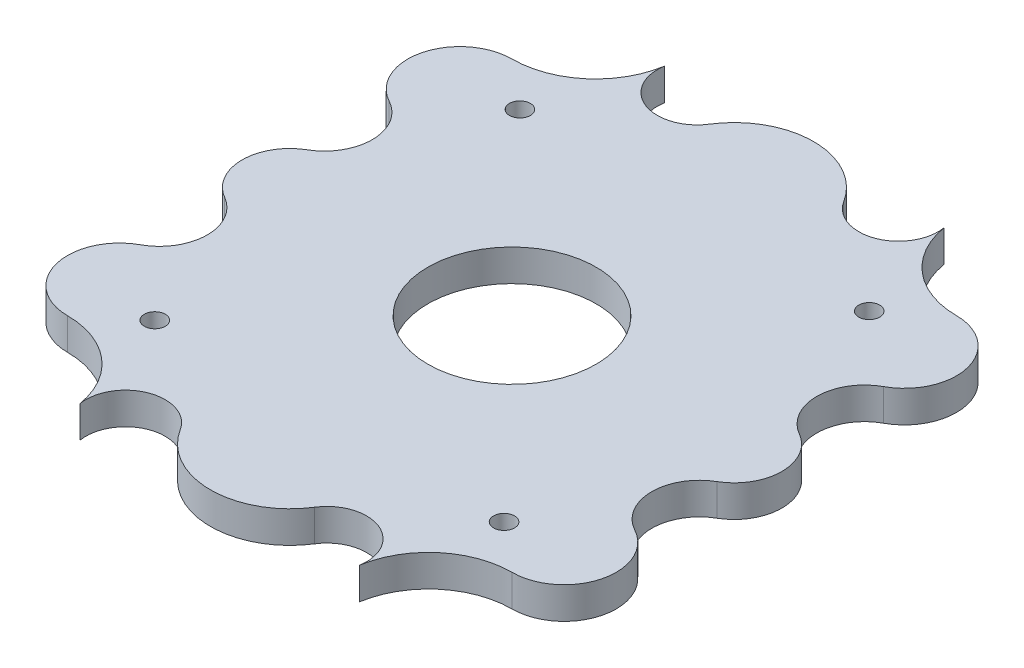
ISO-10303-21;
HEADER;
FILE_DESCRIPTION(('STEP AP214'),'2;1');
FILE_NAME('part.step','',(''),(''),'','','');
FILE_SCHEMA(('AUTOMOTIVE_DESIGN { 1 0 10303 214 1 1 1 1 }'));
ENDSEC;
DATA;
#1=APPLICATION_CONTEXT('core data for automotive mechanical design processes');
#2=APPLICATION_PROTOCOL_DEFINITION('international standard','automotive_design',2000,#1);
#3=PRODUCT_CONTEXT('',#1,'mechanical');
#4=PRODUCT('Part','Part','',(#3));
#5=PRODUCT_RELATED_PRODUCT_CATEGORY('part','',(#4));
#6=PRODUCT_DEFINITION_FORMATION('','',#4);
#7=PRODUCT_DEFINITION_CONTEXT('part definition',#1,'design');
#8=PRODUCT_DEFINITION('design','',#6,#7);
#9=PRODUCT_DEFINITION_SHAPE('','',#8);
#10=(LENGTH_UNIT() NAMED_UNIT(*) SI_UNIT(.MILLI.,.METRE.));
#11=(NAMED_UNIT(*) PLANE_ANGLE_UNIT() SI_UNIT($,.RADIAN.));
#12=(NAMED_UNIT(*) SI_UNIT($,.STERADIAN.) SOLID_ANGLE_UNIT());
#13=UNCERTAINTY_MEASURE_WITH_UNIT(LENGTH_MEASURE(1.E-05),#10,'distance_accuracy_value','');
#14=(GEOMETRIC_REPRESENTATION_CONTEXT(3) GLOBAL_UNCERTAINTY_ASSIGNED_CONTEXT((#13)) GLOBAL_UNIT_ASSIGNED_CONTEXT((#10,
#11,#12)) REPRESENTATION_CONTEXT('',''));
#15=CARTESIAN_POINT('',(0.,0.,0.));
#16=DIRECTION('',(0.,0.,1.));
#17=DIRECTION('',(1.,0.,0.));
#18=AXIS2_PLACEMENT_3D('',#15,#16,#17);
#19=CARTESIAN_POINT('',(70.,0.,-96.2922747821949));
#20=DIRECTION('',(0.,1.,0.));
#21=DIRECTION('',(0.,0.,1.));
#22=AXIS2_PLACEMENT_3D('',#19,#20,#21);
#23=PLANE('',#22);
#24=CARTESIAN_POINT('',(-55.,0.,57.5));
#25=DIRECTION('',(0.,-1.,0.));
#26=DIRECTION('',(0.,0.,-1.));
#27=AXIS2_PLACEMENT_3D('',#24,#25,#26);
#28=CIRCLE('',#27,5.49999999999999);
#29=CARTESIAN_POINT('',(-55.,0.,52.));
#30=VERTEX_POINT('',#29);
#31=EDGE_CURVE('E657',#30,#30,#28,.T.);
#32=ORIENTED_EDGE('',*,*,#31,.F.);
#33=EDGE_LOOP('',(#32));
#34=FACE_BOUND('',#33,.T.);
#35=CARTESIAN_POINT('',(55.,0.,57.5));
#36=DIRECTION('',(0.,-1.,0.));
#37=DIRECTION('',(0.,0.,-1.));
#38=AXIS2_PLACEMENT_3D('',#35,#36,#37);
#39=CIRCLE('',#38,5.49999999999999);
#40=CARTESIAN_POINT('',(55.,0.,52.));
#41=VERTEX_POINT('',#40);
#42=EDGE_CURVE('E667',#41,#41,#39,.T.);
#43=ORIENTED_EDGE('',*,*,#42,.F.);
#44=EDGE_LOOP('',(#43));
#45=FACE_BOUND('',#44,.T.);
#46=CARTESIAN_POINT('',(55.,0.,-57.5));
#47=DIRECTION('',(0.,-1.,0.));
#48=DIRECTION('',(0.,0.,-1.));
#49=AXIS2_PLACEMENT_3D('',#46,#47,#48);
#50=CIRCLE('',#49,5.49999999999999);
#51=CARTESIAN_POINT('',(55.,0.,-63.));
#52=VERTEX_POINT('',#51);
#53=EDGE_CURVE('E679',#52,#52,#50,.T.);
#54=ORIENTED_EDGE('',*,*,#53,.F.);
#55=EDGE_LOOP('',(#54));
#56=FACE_BOUND('',#55,.T.);
#57=CARTESIAN_POINT('',(0.,0.,0.));
#58=DIRECTION('',(0.,1.,0.));
#59=DIRECTION('',(0.,0.,1.));
#60=AXIS2_PLACEMENT_3D('',#57,#58,#59);
#61=CIRCLE('',#60,26.5);
#62=CARTESIAN_POINT('',(0.,0.,26.5));
#63=VERTEX_POINT('',#62);
#64=EDGE_CURVE('E275',#63,#63,#61,.T.);
#65=ORIENTED_EDGE('',*,*,#64,.T.);
#66=EDGE_LOOP('',(#65));
#67=FACE_BOUND('',#66,.T.);
#68=CARTESIAN_POINT('',(70.,0.,-96.2922747821949));
#69=DIRECTION('',(0.,-1.,0.));
#70=DIRECTION('',(0.,0.,1.));
#71=AXIS2_PLACEMENT_3D('',#68,#69,#70);
#72=CIRCLE('',#71,26.2922747821949);
#73=CARTESIAN_POINT('',(70.,0.,-70.));
#74=VERTEX_POINT('',#73);
#75=CARTESIAN_POINT('',(44.0559087554756,0.,-92.0275540740791));
#76=VERTEX_POINT('',#75);
#77=EDGE_CURVE('E176',#74,#76,#72,.T.);
#78=ORIENTED_EDGE('',*,*,#77,.F.);
#79=CARTESIAN_POINT('',(70.,0.,-53.5842229288624));
#80=DIRECTION('',(0.,1.,0.));
#81=DIRECTION('',(0.,0.,1.));
#82=AXIS2_PLACEMENT_3D('',#79,#80,#81);
#83=CIRCLE('',#82,16.4157770711376);
#84=CARTESIAN_POINT('',(77.8379934868232,0.,-39.1605065232405));
#85=VERTEX_POINT('',#84);
#86=EDGE_CURVE('E327',#85,#74,#83,.T.);
#87=ORIENTED_EDGE('',*,*,#86,.F.);
#88=CARTESIAN_POINT('',(85.,0.,-25.9807621135332));
#89=DIRECTION('',(0.,1.,0.));
#90=DIRECTION('',(0.,0.,1.));
#91=AXIS2_PLACEMENT_3D('',#88,#89,#90);
#92=CIRCLE('',#91,15.);
#93=CARTESIAN_POINT('',(77.5,0.,-12.9903810567666));
#94=VERTEX_POINT('',#93);
#95=EDGE_CURVE('E324',#85,#94,#92,.T.);
#96=ORIENTED_EDGE('',*,*,#95,.T.);
#97=CARTESIAN_POINT('',(70.,0.,0.));
#98=DIRECTION('',(0.,1.,0.));
#99=DIRECTION('',(0.,0.,1.));
#100=AXIS2_PLACEMENT_3D('',#97,#98,#99);
#101=CIRCLE('',#100,15.);
#102=CARTESIAN_POINT('',(77.5000000000001,0.,12.9903810567666));
#103=VERTEX_POINT('',#102);
#104=EDGE_CURVE('E308',#103,#94,#101,.T.);
#105=ORIENTED_EDGE('',*,*,#104,.F.);
#106=CARTESIAN_POINT('',(85.,0.,25.9807621135332));
#107=DIRECTION('',(0.,1.,0.));
#108=DIRECTION('',(0.,0.,1.));
#109=AXIS2_PLACEMENT_3D('',#106,#107,#108);
#110=CIRCLE('',#109,15.);
#111=CARTESIAN_POINT('',(77.8379934868232,0.,39.1605065232405));
#112=VERTEX_POINT('',#111);
#113=EDGE_CURVE('E264',#112,#103,#110,.F.);
#114=ORIENTED_EDGE('',*,*,#113,.F.);
#115=CARTESIAN_POINT('',(70.,0.,53.5842229288624));
#116=DIRECTION('',(0.,1.,0.));
#117=DIRECTION('',(0.,0.,1.));
#118=AXIS2_PLACEMENT_3D('',#115,#116,#117);
#119=CIRCLE('',#118,16.4157770711376);
#120=CARTESIAN_POINT('',(70.,0.,70.));
#121=VERTEX_POINT('',#120);
#122=EDGE_CURVE('E260',#112,#121,#119,.F.);
#123=ORIENTED_EDGE('',*,*,#122,.T.);
#124=CARTESIAN_POINT('',(70.,0.,96.2922747821949));
#125=DIRECTION('',(0.,-1.,0.));
#126=DIRECTION('',(0.,0.,-1.));
#127=AXIS2_PLACEMENT_3D('',#124,#125,#126);
#128=CIRCLE('',#127,26.2922747821949);
#129=CARTESIAN_POINT('',(44.0559087554756,0.,92.0275540740791));
#130=VERTEX_POINT('',#129);
#131=EDGE_CURVE('E120',#130,#121,#128,.T.);
#132=ORIENTED_EDGE('',*,*,#131,.F.);
#133=CARTESIAN_POINT('',(31.7214438511238,0.,90.));
#134=DIRECTION('',(0.,-1.,0.));
#135=DIRECTION('',(0.,0.,-1.));
#136=AXIS2_PLACEMENT_3D('',#133,#134,#135);
#137=CIRCLE('',#136,12.5);
#138=CARTESIAN_POINT('',(21.1476292340825,0.,83.3333333333333));
#139=VERTEX_POINT('',#138);
#140=EDGE_CURVE('E113',#139,#130,#137,.T.);
#141=ORIENTED_EDGE('',*,*,#140,.F.);
#142=CARTESIAN_POINT('',(0.,0.,70.));
#143=DIRECTION('',(0.,1.,0.));
#144=DIRECTION('',(0.,0.,1.));
#145=AXIS2_PLACEMENT_3D('',#142,#143,#144);
#146=CIRCLE('',#145,25.);
#147=CARTESIAN_POINT('',(-21.1476292340825,0.,83.3333333333333));
#148=VERTEX_POINT('',#147);
#149=EDGE_CURVE('E192',#148,#139,#146,.T.);
#150=ORIENTED_EDGE('',*,*,#149,.F.);
#151=CARTESIAN_POINT('',(-31.7214438511238,0.,90.));
#152=DIRECTION('',(0.,-1.,0.));
#153=DIRECTION('',(0.,0.,1.));
#154=AXIS2_PLACEMENT_3D('',#151,#152,#153);
#155=CIRCLE('',#154,12.5);
#156=CARTESIAN_POINT('',(-44.0559087554755,0.,92.0275540740791));
#157=VERTEX_POINT('',#156);
#158=EDGE_CURVE('E190',#157,#148,#155,.T.);
#159=ORIENTED_EDGE('',*,*,#158,.F.);
#160=CARTESIAN_POINT('',(-70.,0.,96.2922747821949));
#161=DIRECTION('',(0.,-1.,0.));
#162=DIRECTION('',(0.,0.,1.));
#163=AXIS2_PLACEMENT_3D('',#160,#161,#162);
#164=CIRCLE('',#163,26.2922747821949);
#165=CARTESIAN_POINT('',(-70.,0.,70.));
#166=VERTEX_POINT('',#165);
#167=EDGE_CURVE('E188',#166,#157,#164,.T.);
#168=ORIENTED_EDGE('',*,*,#167,.F.);
#169=CARTESIAN_POINT('',(-70.,0.,53.5842229288624));
#170=DIRECTION('',(0.,1.,0.));
#171=DIRECTION('',(0.,0.,1.));
#172=AXIS2_PLACEMENT_3D('',#169,#170,#171);
#173=CIRCLE('',#172,16.4157770711376);
#174=CARTESIAN_POINT('',(-77.8379934868231,0.,39.1605065232405));
#175=VERTEX_POINT('',#174);
#176=EDGE_CURVE('E285',#175,#166,#173,.T.);
#177=ORIENTED_EDGE('',*,*,#176,.F.);
#178=CARTESIAN_POINT('',(-85.,0.,25.9807621135332));
#179=DIRECTION('',(0.,1.,0.));
#180=DIRECTION('',(0.,0.,1.));
#181=AXIS2_PLACEMENT_3D('',#178,#179,#180);
#182=CIRCLE('',#181,15.);
#183=CARTESIAN_POINT('',(-77.5,0.,12.9903810567666));
#184=VERTEX_POINT('',#183);
#185=EDGE_CURVE('E294',#175,#184,#182,.T.);
#186=ORIENTED_EDGE('',*,*,#185,.T.);
#187=CARTESIAN_POINT('',(-70.,0.,0.));
#188=DIRECTION('',(0.,1.,0.));
#189=DIRECTION('',(0.,0.,1.));
#190=AXIS2_PLACEMENT_3D('',#187,#188,#189);
#191=CIRCLE('',#190,15.);
#192=CARTESIAN_POINT('',(-77.5,0.,-12.9903810567666));
#193=VERTEX_POINT('',#192);
#194=EDGE_CURVE('E305',#184,#193,#191,.F.);
#195=ORIENTED_EDGE('',*,*,#194,.T.);
#196=CARTESIAN_POINT('',(-85.,0.,-25.9807621135331));
#197=DIRECTION('',(0.,1.,0.));
#198=DIRECTION('',(0.,0.,1.));
#199=AXIS2_PLACEMENT_3D('',#196,#197,#198);
#200=CIRCLE('',#199,15.);
#201=CARTESIAN_POINT('',(-77.8379934868232,0.,-39.1605065232405));
#202=VERTEX_POINT('',#201);
#203=EDGE_CURVE('E341',#202,#193,#200,.F.);
#204=ORIENTED_EDGE('',*,*,#203,.F.);
#205=CARTESIAN_POINT('',(-70.,0.,-53.5842229288624));
#206=DIRECTION('',(0.,1.,0.));
#207=DIRECTION('',(0.,0.,1.));
#208=AXIS2_PLACEMENT_3D('',#205,#206,#207);
#209=CIRCLE('',#208,16.4157770711376);
#210=CARTESIAN_POINT('',(-70.,0.,-70.));
#211=VERTEX_POINT('',#210);
#212=EDGE_CURVE('E339',#202,#211,#209,.F.);
#213=ORIENTED_EDGE('',*,*,#212,.T.);
#214=CARTESIAN_POINT('',(-70.,0.,-96.2922747821949));
#215=DIRECTION('',(0.,-1.,0.));
#216=DIRECTION('',(0.,0.,-1.));
#217=AXIS2_PLACEMENT_3D('',#214,#215,#216);
#218=CIRCLE('',#217,26.2922747821949);
#219=CARTESIAN_POINT('',(-44.0559087554755,0.,-92.0275540740791));
#220=VERTEX_POINT('',#219);
#221=EDGE_CURVE('E186',#220,#211,#218,.T.);
#222=ORIENTED_EDGE('',*,*,#221,.F.);
#223=CARTESIAN_POINT('',(-31.7214438511238,0.,-90.));
#224=DIRECTION('',(0.,-1.,0.));
#225=DIRECTION('',(0.,0.,-1.));
#226=AXIS2_PLACEMENT_3D('',#223,#224,#225);
#227=CIRCLE('',#226,12.5);
#228=CARTESIAN_POINT('',(-21.1476292340825,0.,-83.3333333333333));
#229=VERTEX_POINT('',#228);
#230=EDGE_CURVE('E184',#229,#220,#227,.T.);
#231=ORIENTED_EDGE('',*,*,#230,.F.);
#232=CARTESIAN_POINT('',(0.,0.,-70.));
#233=DIRECTION('',(0.,1.,0.));
#234=DIRECTION('',(0.,0.,-1.));
#235=AXIS2_PLACEMENT_3D('',#232,#233,#234);
#236=CIRCLE('',#235,25.);
#237=CARTESIAN_POINT('',(21.1476292340825,0.,-83.3333333333333));
#238=VERTEX_POINT('',#237);
#239=EDGE_CURVE('E182',#238,#229,#236,.T.);
#240=ORIENTED_EDGE('',*,*,#239,.F.);
#241=CARTESIAN_POINT('',(31.7214438511238,0.,-90.));
#242=DIRECTION('',(0.,-1.,0.));
#243=DIRECTION('',(0.,0.,1.));
#244=AXIS2_PLACEMENT_3D('',#241,#242,#243);
#245=CIRCLE('',#244,12.5);
#246=EDGE_CURVE('E179',#76,#238,#245,.T.);
#247=ORIENTED_EDGE('',*,*,#246,.F.);
#248=EDGE_LOOP('',(#78,#87,#96,#105,#114,#123,#132,#141,#150,#159,#168,#177,#186,#195,#204,#213,
#222,#231,#240,#247));
#249=FACE_BOUND('',#248,.T.);
#250=CARTESIAN_POINT('',(-55.,0.,-57.5));
#251=DIRECTION('',(0.,-1.,0.));
#252=DIRECTION('',(0.,0.,-1.));
#253=AXIS2_PLACEMENT_3D('',#250,#251,#252);
#254=CIRCLE('',#253,5.49999999999999);
#255=CARTESIAN_POINT('',(-55.,0.,-63.));
#256=VERTEX_POINT('',#255);
#257=EDGE_CURVE('E691',#256,#256,#254,.T.);
#258=ORIENTED_EDGE('',*,*,#257,.F.);
#259=EDGE_LOOP('',(#258));
#260=FACE_BOUND('',#259,.T.);
#261=ADVANCED_FACE('F59',(#34,#45,#56,#67,#249,#260),#23,.F.);
#262=CARTESIAN_POINT('',(70.,10.,-96.2922747821949));
#263=DIRECTION('',(0.,-1.,0.));
#264=DIRECTION('',(0.,0.,-1.));
#265=AXIS2_PLACEMENT_3D('',#262,#263,#264);
#266=CYLINDRICAL_SURFACE('',#265,26.2922747821949);
#267=ORIENTED_EDGE('',*,*,#77,.T.);
#268=DIRECTION('',(0.,-1.,0.));
#269=VECTOR('',#268,1.);
#270=CARTESIAN_POINT('',(44.0559087554756,10.,-92.0275540740791));
#271=LINE('',#270,#269);
#272=CARTESIAN_POINT('',(44.0559087554756,10.,-92.0275540740791));
#273=VERTEX_POINT('',#272);
#274=EDGE_CURVE('E12',#273,#76,#271,.T.);
#275=ORIENTED_EDGE('',*,*,#274,.F.);
#276=CARTESIAN_POINT('',(70.,10.,-96.2922747821949));
#277=DIRECTION('',(0.,-1.,0.));
#278=DIRECTION('',(0.,0.,1.));
#279=AXIS2_PLACEMENT_3D('',#276,#277,#278);
#280=CIRCLE('',#279,26.2922747821949);
#281=CARTESIAN_POINT('',(70.,10.,-70.));
#282=VERTEX_POINT('',#281);
#283=EDGE_CURVE('E76',#282,#273,#280,.T.);
#284=ORIENTED_EDGE('',*,*,#283,.F.);
#285=DIRECTION('',(0.,-1.,0.));
#286=VECTOR('',#285,1.);
#287=CARTESIAN_POINT('',(70.,10.,-70.));
#288=LINE('',#287,#286);
#289=EDGE_CURVE('E171',#282,#74,#288,.T.);
#290=ORIENTED_EDGE('',*,*,#289,.T.);
#291=EDGE_LOOP('',(#267,#275,#284,#290));
#292=FACE_BOUND('',#291,.T.);
#293=ADVANCED_FACE('F61',(#292),#266,.F.);
#294=CARTESIAN_POINT('',(31.7214438511238,10.,-90.));
#295=DIRECTION('',(0.,-1.,0.));
#296=DIRECTION('',(0.,0.,-1.));
#297=AXIS2_PLACEMENT_3D('',#294,#295,#296);
#298=CYLINDRICAL_SURFACE('',#297,12.5);
#299=ORIENTED_EDGE('',*,*,#246,.T.);
#300=DIRECTION('',(0.,-1.,0.));
#301=VECTOR('',#300,1.);
#302=CARTESIAN_POINT('',(21.1476292340825,10.,-83.3333333333333));
#303=LINE('',#302,#301);
#304=CARTESIAN_POINT('',(21.1476292340825,10.,-83.3333333333333));
#305=VERTEX_POINT('',#304);
#306=EDGE_CURVE('E68',#305,#238,#303,.T.);
#307=ORIENTED_EDGE('',*,*,#306,.F.);
#308=CARTESIAN_POINT('',(31.7214438511238,10.,-90.));
#309=DIRECTION('',(0.,-1.,0.));
#310=DIRECTION('',(0.,0.,1.));
#311=AXIS2_PLACEMENT_3D('',#308,#309,#310);
#312=CIRCLE('',#311,12.5);
#313=EDGE_CURVE('E128',#273,#305,#312,.T.);
#314=ORIENTED_EDGE('',*,*,#313,.F.);
#315=ORIENTED_EDGE('',*,*,#274,.T.);
#316=EDGE_LOOP('',(#299,#307,#314,#315));
#317=FACE_BOUND('',#316,.T.);
#318=ADVANCED_FACE('F353',(#317),#298,.F.);
#319=CARTESIAN_POINT('',(0.,10.,-70.));
#320=DIRECTION('',(0.,-1.,0.));
#321=DIRECTION('',(0.,0.,-1.));
#322=AXIS2_PLACEMENT_3D('',#319,#320,#321);
#323=CYLINDRICAL_SURFACE('',#322,25.);
#324=ORIENTED_EDGE('',*,*,#239,.T.);
#325=DIRECTION('',(0.,-1.,0.));
#326=VECTOR('',#325,1.);
#327=CARTESIAN_POINT('',(-21.1476292340825,10.,-83.3333333333333));
#328=LINE('',#327,#326);
#329=CARTESIAN_POINT('',(-21.1476292340825,10.,-83.3333333333333));
#330=VERTEX_POINT('',#329);
#331=EDGE_CURVE('E213',#330,#229,#328,.T.);
#332=ORIENTED_EDGE('',*,*,#331,.F.);
#333=CARTESIAN_POINT('',(0.,10.,-70.));
#334=DIRECTION('',(0.,1.,0.));
#335=DIRECTION('',(0.,0.,-1.));
#336=AXIS2_PLACEMENT_3D('',#333,#334,#335);
#337=CIRCLE('',#336,25.);
#338=EDGE_CURVE('E221',#305,#330,#337,.T.);
#339=ORIENTED_EDGE('',*,*,#338,.F.);
#340=ORIENTED_EDGE('',*,*,#306,.T.);
#341=EDGE_LOOP('',(#324,#332,#339,#340));
#342=FACE_BOUND('',#341,.T.);
#343=ADVANCED_FACE('F219',(#342),#323,.T.);
#344=CARTESIAN_POINT('',(-31.7214438511238,10.,-90.));
#345=DIRECTION('',(0.,-1.,0.));
#346=DIRECTION('',(0.,0.,-1.));
#347=AXIS2_PLACEMENT_3D('',#344,#345,#346);
#348=CYLINDRICAL_SURFACE('',#347,12.5);
#349=ORIENTED_EDGE('',*,*,#230,.T.);
#350=DIRECTION('',(0.,-1.,0.));
#351=VECTOR('',#350,1.);
#352=CARTESIAN_POINT('',(-44.0559087554755,10.,-92.0275540740791));
#353=LINE('',#352,#351);
#354=CARTESIAN_POINT('',(-44.0559087554755,10.,-92.0275540740791));
#355=VERTEX_POINT('',#354);
#356=EDGE_CURVE('E210',#355,#220,#353,.T.);
#357=ORIENTED_EDGE('',*,*,#356,.F.);
#358=CARTESIAN_POINT('',(-31.7214438511238,10.,-90.));
#359=DIRECTION('',(0.,-1.,0.));
#360=DIRECTION('',(0.,0.,-1.));
#361=AXIS2_PLACEMENT_3D('',#358,#359,#360);
#362=CIRCLE('',#361,12.5);
#363=EDGE_CURVE('E240',#330,#355,#362,.T.);
#364=ORIENTED_EDGE('',*,*,#363,.F.);
#365=ORIENTED_EDGE('',*,*,#331,.T.);
#366=EDGE_LOOP('',(#349,#357,#364,#365));
#367=FACE_BOUND('',#366,.T.);
#368=ADVANCED_FACE('F230',(#367),#348,.F.);
#369=CARTESIAN_POINT('',(-70.,10.,-96.2922747821949));
#370=DIRECTION('',(0.,-1.,0.));
#371=DIRECTION('',(0.,0.,-1.));
#372=AXIS2_PLACEMENT_3D('',#369,#370,#371);
#373=CYLINDRICAL_SURFACE('',#372,26.2922747821949);
#374=ORIENTED_EDGE('',*,*,#221,.T.);
#375=DIRECTION('',(0.,-1.,0.));
#376=VECTOR('',#375,1.);
#377=CARTESIAN_POINT('',(-70.,10.,-70.));
#378=LINE('',#377,#376);
#379=CARTESIAN_POINT('',(-70.,10.,-70.));
#380=VERTEX_POINT('',#379);
#381=EDGE_CURVE('E207',#380,#211,#378,.T.);
#382=ORIENTED_EDGE('',*,*,#381,.F.);
#383=CARTESIAN_POINT('',(-70.,10.,-96.2922747821949));
#384=DIRECTION('',(0.,-1.,0.));
#385=DIRECTION('',(0.,0.,-1.));
#386=AXIS2_PLACEMENT_3D('',#383,#384,#385);
#387=CIRCLE('',#386,26.2922747821949);
#388=EDGE_CURVE('E236',#355,#380,#387,.T.);
#389=ORIENTED_EDGE('',*,*,#388,.F.);
#390=ORIENTED_EDGE('',*,*,#356,.T.);
#391=EDGE_LOOP('',(#374,#382,#389,#390));
#392=FACE_BOUND('',#391,.T.);
#393=ADVANCED_FACE('F234',(#392),#373,.F.);
#394=CARTESIAN_POINT('',(-70.,10.,96.2922747821949));
#395=DIRECTION('',(0.,-1.,0.));
#396=DIRECTION('',(0.,0.,-1.));
#397=AXIS2_PLACEMENT_3D('',#394,#395,#396);
#398=CYLINDRICAL_SURFACE('',#397,26.2922747821949);
#399=ORIENTED_EDGE('',*,*,#167,.T.);
#400=DIRECTION('',(0.,-1.,0.));
#401=VECTOR('',#400,1.);
#402=CARTESIAN_POINT('',(-44.0559087554755,10.,92.0275540740791));
#403=LINE('',#402,#401);
#404=CARTESIAN_POINT('',(-44.0559087554755,10.,92.0275540740791));
#405=VERTEX_POINT('',#404);
#406=EDGE_CURVE('E201',#405,#157,#403,.T.);
#407=ORIENTED_EDGE('',*,*,#406,.F.);
#408=CARTESIAN_POINT('',(-70.,10.,96.2922747821949));
#409=DIRECTION('',(0.,-1.,0.));
#410=DIRECTION('',(0.,0.,1.));
#411=AXIS2_PLACEMENT_3D('',#408,#409,#410);
#412=CIRCLE('',#411,26.2922747821949);
#413=CARTESIAN_POINT('',(-70.,10.,70.));
#414=VERTEX_POINT('',#413);
#415=EDGE_CURVE('E239',#414,#405,#412,.T.);
#416=ORIENTED_EDGE('',*,*,#415,.F.);
#417=DIRECTION('',(0.,-1.,0.));
#418=VECTOR('',#417,1.);
#419=CARTESIAN_POINT('',(-70.,10.,70.));
#420=LINE('',#419,#418);
#421=EDGE_CURVE('E204',#414,#166,#420,.T.);
#422=ORIENTED_EDGE('',*,*,#421,.T.);
#423=EDGE_LOOP('',(#399,#407,#416,#422));
#424=FACE_BOUND('',#423,.T.);
#425=ADVANCED_FACE('F380',(#424),#398,.F.);
#426=CARTESIAN_POINT('',(-31.7214438511238,10.,90.));
#427=DIRECTION('',(0.,-1.,0.));
#428=DIRECTION('',(0.,0.,-1.));
#429=AXIS2_PLACEMENT_3D('',#426,#427,#428);
#430=CYLINDRICAL_SURFACE('',#429,12.5);
#431=ORIENTED_EDGE('',*,*,#158,.T.);
#432=DIRECTION('',(0.,-1.,0.));
#433=VECTOR('',#432,1.);
#434=CARTESIAN_POINT('',(-21.1476292340825,10.,83.3333333333333));
#435=LINE('',#434,#433);
#436=CARTESIAN_POINT('',(-21.1476292340825,10.,83.3333333333333));
#437=VERTEX_POINT('',#436);
#438=EDGE_CURVE('E198',#437,#148,#435,.T.);
#439=ORIENTED_EDGE('',*,*,#438,.F.);
#440=CARTESIAN_POINT('',(-31.7214438511238,10.,90.));
#441=DIRECTION('',(0.,-1.,0.));
#442=DIRECTION('',(0.,0.,1.));
#443=AXIS2_PLACEMENT_3D('',#440,#441,#442);
#444=CIRCLE('',#443,12.5);
#445=EDGE_CURVE('E242',#405,#437,#444,.T.);
#446=ORIENTED_EDGE('',*,*,#445,.F.);
#447=ORIENTED_EDGE('',*,*,#406,.T.);
#448=EDGE_LOOP('',(#431,#439,#446,#447));
#449=FACE_BOUND('',#448,.T.);
#450=ADVANCED_FACE('F253',(#449),#430,.F.);
#451=CARTESIAN_POINT('',(0.,10.,70.));
#452=DIRECTION('',(0.,-1.,0.));
#453=DIRECTION('',(0.,0.,-1.));
#454=AXIS2_PLACEMENT_3D('',#451,#452,#453);
#455=CYLINDRICAL_SURFACE('',#454,25.);
#456=ORIENTED_EDGE('',*,*,#149,.T.);
#457=DIRECTION('',(0.,-1.,0.));
#458=VECTOR('',#457,1.);
#459=CARTESIAN_POINT('',(21.1476292340825,10.,83.3333333333333));
#460=LINE('',#459,#458);
#461=CARTESIAN_POINT('',(21.1476292340825,10.,83.3333333333333));
#462=VERTEX_POINT('',#461);
#463=EDGE_CURVE('E165',#462,#139,#460,.T.);
#464=ORIENTED_EDGE('',*,*,#463,.F.);
#465=CARTESIAN_POINT('',(0.,10.,70.));
#466=DIRECTION('',(0.,1.,0.));
#467=DIRECTION('',(0.,0.,1.));
#468=AXIS2_PLACEMENT_3D('',#465,#466,#467);
#469=CIRCLE('',#468,25.);
#470=EDGE_CURVE('E160',#437,#462,#469,.T.);
#471=ORIENTED_EDGE('',*,*,#470,.F.);
#472=ORIENTED_EDGE('',*,*,#438,.T.);
#473=EDGE_LOOP('',(#456,#464,#471,#472));
#474=FACE_BOUND('',#473,.T.);
#475=ADVANCED_FACE('F257',(#474),#455,.T.);
#476=CARTESIAN_POINT('',(31.7214438511238,10.,90.));
#477=DIRECTION('',(0.,-1.,0.));
#478=DIRECTION('',(0.,0.,-1.));
#479=AXIS2_PLACEMENT_3D('',#476,#477,#478);
#480=CYLINDRICAL_SURFACE('',#479,12.5);
#481=ORIENTED_EDGE('',*,*,#140,.T.);
#482=DIRECTION('',(0.,-1.,0.));
#483=VECTOR('',#482,1.);
#484=CARTESIAN_POINT('',(44.0559087554756,10.,92.0275540740791));
#485=LINE('',#484,#483);
#486=CARTESIAN_POINT('',(44.0559087554756,10.,92.0275540740791));
#487=VERTEX_POINT('',#486);
#488=EDGE_CURVE('E163',#487,#130,#485,.T.);
#489=ORIENTED_EDGE('',*,*,#488,.F.);
#490=CARTESIAN_POINT('',(31.7214438511238,10.,90.));
#491=DIRECTION('',(0.,-1.,0.));
#492=DIRECTION('',(0.,0.,-1.));
#493=AXIS2_PLACEMENT_3D('',#490,#491,#492);
#494=CIRCLE('',#493,12.5);
#495=EDGE_CURVE('E154',#462,#487,#494,.T.);
#496=ORIENTED_EDGE('',*,*,#495,.F.);
#497=ORIENTED_EDGE('',*,*,#463,.T.);
#498=EDGE_LOOP('',(#481,#489,#496,#497));
#499=FACE_BOUND('',#498,.T.);
#500=ADVANCED_FACE('F164',(#499),#480,.F.);
#501=CARTESIAN_POINT('',(70.,10.,96.2922747821949));
#502=DIRECTION('',(0.,-1.,0.));
#503=DIRECTION('',(0.,0.,-1.));
#504=AXIS2_PLACEMENT_3D('',#501,#502,#503);
#505=CYLINDRICAL_SURFACE('',#504,26.2922747821949);
#506=ORIENTED_EDGE('',*,*,#131,.T.);
#507=DIRECTION('',(0.,-1.,0.));
#508=VECTOR('',#507,1.);
#509=CARTESIAN_POINT('',(70.,10.,70.));
#510=LINE('',#509,#508);
#511=CARTESIAN_POINT('',(70.,10.,70.));
#512=VERTEX_POINT('',#511);
#513=EDGE_CURVE('E166',#512,#121,#510,.T.);
#514=ORIENTED_EDGE('',*,*,#513,.F.);
#515=CARTESIAN_POINT('',(70.,10.,96.2922747821949));
#516=DIRECTION('',(0.,-1.,0.));
#517=DIRECTION('',(0.,0.,-1.));
#518=AXIS2_PLACEMENT_3D('',#515,#516,#517);
#519=CIRCLE('',#518,26.2922747821949);
#520=EDGE_CURVE('E158',#487,#512,#519,.T.);
#521=ORIENTED_EDGE('',*,*,#520,.F.);
#522=ORIENTED_EDGE('',*,*,#488,.T.);
#523=EDGE_LOOP('',(#506,#514,#521,#522));
#524=FACE_BOUND('',#523,.T.);
#525=ADVANCED_FACE('F168',(#524),#505,.F.);
#526=CARTESIAN_POINT('',(70.,10.,-96.2922747821949));
#527=DIRECTION('',(0.,1.,0.));
#528=DIRECTION('',(0.,0.,1.));
#529=AXIS2_PLACEMENT_3D('',#526,#527,#528);
#530=PLANE('',#529);
#531=CARTESIAN_POINT('',(-55.,10.,57.5));
#532=DIRECTION('',(0.,-1.,0.));
#533=DIRECTION('',(0.,0.,-1.));
#534=AXIS2_PLACEMENT_3D('',#531,#532,#533);
#535=CIRCLE('',#534,3.3);
#536=CARTESIAN_POINT('',(-55.,10.,54.2));
#537=VERTEX_POINT('',#536);
#538=EDGE_CURVE('E664',#537,#537,#535,.T.);
#539=ORIENTED_EDGE('',*,*,#538,.T.);
#540=EDGE_LOOP('',(#539));
#541=FACE_BOUND('',#540,.T.);
#542=CARTESIAN_POINT('',(55.,10.,57.5));
#543=DIRECTION('',(0.,-1.,0.));
#544=DIRECTION('',(0.,0.,-1.));
#545=AXIS2_PLACEMENT_3D('',#542,#543,#544);
#546=CIRCLE('',#545,3.3);
#547=CARTESIAN_POINT('',(55.,10.,54.2));
#548=VERTEX_POINT('',#547);
#549=EDGE_CURVE('E676',#548,#548,#546,.T.);
#550=ORIENTED_EDGE('',*,*,#549,.T.);
#551=EDGE_LOOP('',(#550));
#552=FACE_BOUND('',#551,.T.);
#553=CARTESIAN_POINT('',(55.,10.,-57.5));
#554=DIRECTION('',(0.,-1.,0.));
#555=DIRECTION('',(0.,0.,-1.));
#556=AXIS2_PLACEMENT_3D('',#553,#554,#555);
#557=CIRCLE('',#556,3.3);
#558=CARTESIAN_POINT('',(55.,10.,-60.8));
#559=VERTEX_POINT('',#558);
#560=EDGE_CURVE('E688',#559,#559,#557,.T.);
#561=ORIENTED_EDGE('',*,*,#560,.T.);
#562=EDGE_LOOP('',(#561));
#563=FACE_BOUND('',#562,.T.);
#564=CARTESIAN_POINT('',(-55.,10.,-57.5));
#565=DIRECTION('',(0.,-1.,0.));
#566=DIRECTION('',(0.,0.,-1.));
#567=AXIS2_PLACEMENT_3D('',#564,#565,#566);
#568=CIRCLE('',#567,3.3);
#569=CARTESIAN_POINT('',(-55.,10.,-60.8));
#570=VERTEX_POINT('',#569);
#571=EDGE_CURVE('E700',#570,#570,#568,.T.);
#572=ORIENTED_EDGE('',*,*,#571,.T.);
#573=EDGE_LOOP('',(#572));
#574=FACE_BOUND('',#573,.T.);
#575=CARTESIAN_POINT('',(0.,10.,0.));
#576=DIRECTION('',(0.,1.,0.));
#577=DIRECTION('',(0.,0.,1.));
#578=AXIS2_PLACEMENT_3D('',#575,#576,#577);
#579=CIRCLE('',#578,26.5);
#580=CARTESIAN_POINT('',(0.,10.,26.5));
#581=VERTEX_POINT('',#580);
#582=EDGE_CURVE('E279',#581,#581,#579,.T.);
#583=ORIENTED_EDGE('',*,*,#582,.F.);
#584=EDGE_LOOP('',(#583));
#585=FACE_BOUND('',#584,.T.);
#586=ORIENTED_EDGE('',*,*,#283,.T.);
#587=ORIENTED_EDGE('',*,*,#313,.T.);
#588=ORIENTED_EDGE('',*,*,#338,.T.);
#589=ORIENTED_EDGE('',*,*,#363,.T.);
#590=ORIENTED_EDGE('',*,*,#388,.T.);
#591=CARTESIAN_POINT('',(-70.,10.,-53.5842229288624));
#592=DIRECTION('',(0.,1.,0.));
#593=DIRECTION('',(0.,0.,1.));
#594=AXIS2_PLACEMENT_3D('',#591,#592,#593);
#595=CIRCLE('',#594,16.4157770711376);
#596=CARTESIAN_POINT('',(-77.8379934868232,10.,-39.1605065232405));
#597=VERTEX_POINT('',#596);
#598=EDGE_CURVE('E338',#597,#380,#595,.F.);
#599=ORIENTED_EDGE('',*,*,#598,.F.);
#600=CARTESIAN_POINT('',(-85.,10.,-25.9807621135331));
#601=DIRECTION('',(0.,1.,0.));
#602=DIRECTION('',(0.,0.,1.));
#603=AXIS2_PLACEMENT_3D('',#600,#601,#602);
#604=CIRCLE('',#603,15.);
#605=CARTESIAN_POINT('',(-77.5,10.,-12.9903810567666));
#606=VERTEX_POINT('',#605);
#607=EDGE_CURVE('E342',#597,#606,#604,.F.);
#608=ORIENTED_EDGE('',*,*,#607,.T.);
#609=CARTESIAN_POINT('',(-70.,10.,0.));
#610=DIRECTION('',(0.,1.,0.));
#611=DIRECTION('',(0.,0.,1.));
#612=AXIS2_PLACEMENT_3D('',#609,#610,#611);
#613=CIRCLE('',#612,15.);
#614=CARTESIAN_POINT('',(-77.5,10.,12.9903810567666));
#615=VERTEX_POINT('',#614);
#616=EDGE_CURVE('E298',#615,#606,#613,.F.);
#617=ORIENTED_EDGE('',*,*,#616,.F.);
#618=CARTESIAN_POINT('',(-85.,10.,25.9807621135332));
#619=DIRECTION('',(0.,1.,0.));
#620=DIRECTION('',(0.,0.,1.));
#621=AXIS2_PLACEMENT_3D('',#618,#619,#620);
#622=CIRCLE('',#621,15.);
#623=CARTESIAN_POINT('',(-77.8379934868231,10.,39.1605065232405));
#624=VERTEX_POINT('',#623);
#625=EDGE_CURVE('E288',#624,#615,#622,.T.);
#626=ORIENTED_EDGE('',*,*,#625,.F.);
#627=CARTESIAN_POINT('',(-70.,10.,53.5842229288624));
#628=DIRECTION('',(0.,1.,0.));
#629=DIRECTION('',(0.,0.,1.));
#630=AXIS2_PLACEMENT_3D('',#627,#628,#629);
#631=CIRCLE('',#630,16.4157770711376);
#632=EDGE_CURVE('E286',#624,#414,#631,.T.);
#633=ORIENTED_EDGE('',*,*,#632,.T.);
#634=ORIENTED_EDGE('',*,*,#415,.T.);
#635=ORIENTED_EDGE('',*,*,#445,.T.);
#636=ORIENTED_EDGE('',*,*,#470,.T.);
#637=ORIENTED_EDGE('',*,*,#495,.T.);
#638=ORIENTED_EDGE('',*,*,#520,.T.);
#639=CARTESIAN_POINT('',(70.,10.,53.5842229288624));
#640=DIRECTION('',(0.,1.,0.));
#641=DIRECTION('',(0.,0.,1.));
#642=AXIS2_PLACEMENT_3D('',#639,#640,#641);
#643=CIRCLE('',#642,16.4157770711376);
#644=CARTESIAN_POINT('',(77.8379934868232,10.,39.1605065232405));
#645=VERTEX_POINT('',#644);
#646=EDGE_CURVE('E272',#645,#512,#643,.F.);
#647=ORIENTED_EDGE('',*,*,#646,.F.);
#648=CARTESIAN_POINT('',(85.,10.,25.9807621135332));
#649=DIRECTION('',(0.,1.,0.));
#650=DIRECTION('',(0.,0.,1.));
#651=AXIS2_PLACEMENT_3D('',#648,#649,#650);
#652=CIRCLE('',#651,15.);
#653=CARTESIAN_POINT('',(77.5000000000001,10.,12.9903810567666));
#654=VERTEX_POINT('',#653);
#655=EDGE_CURVE('E312',#645,#654,#652,.F.);
#656=ORIENTED_EDGE('',*,*,#655,.T.);
#657=CARTESIAN_POINT('',(70.,10.,0.));
#658=DIRECTION('',(0.,1.,0.));
#659=DIRECTION('',(0.,0.,1.));
#660=AXIS2_PLACEMENT_3D('',#657,#658,#659);
#661=CIRCLE('',#660,15.);
#662=CARTESIAN_POINT('',(77.5,10.,-12.9903810567666));
#663=VERTEX_POINT('',#662);
#664=EDGE_CURVE('E316',#654,#663,#661,.T.);
#665=ORIENTED_EDGE('',*,*,#664,.T.);
#666=CARTESIAN_POINT('',(85.,10.,-25.9807621135332));
#667=DIRECTION('',(0.,1.,0.));
#668=DIRECTION('',(0.,0.,1.));
#669=AXIS2_PLACEMENT_3D('',#666,#667,#668);
#670=CIRCLE('',#669,15.);
#671=CARTESIAN_POINT('',(77.8379934868232,10.,-39.1605065232405));
#672=VERTEX_POINT('',#671);
#673=EDGE_CURVE('E319',#672,#663,#670,.T.);
#674=ORIENTED_EDGE('',*,*,#673,.F.);
#675=CARTESIAN_POINT('',(70.,10.,-53.5842229288624));
#676=DIRECTION('',(0.,1.,0.));
#677=DIRECTION('',(0.,0.,1.));
#678=AXIS2_PLACEMENT_3D('',#675,#676,#677);
#679=CIRCLE('',#678,16.4157770711376);
#680=EDGE_CURVE('E328',#672,#282,#679,.T.);
#681=ORIENTED_EDGE('',*,*,#680,.T.);
#682=EDGE_LOOP('',(#586,#587,#588,#589,#590,#599,#608,#617,#626,#633,#634,#635,#636,#637,#638,
#647,#656,#665,#674,#681));
#683=FACE_BOUND('',#682,.T.);
#684=ADVANCED_FACE('F155',(#541,#552,#563,#574,#585,#683),#530,.T.);
#685=CARTESIAN_POINT('',(-70.,0.,-53.5842229288624));
#686=DIRECTION('',(0.,1.,0.));
#687=DIRECTION('',(0.,0.,1.));
#688=AXIS2_PLACEMENT_3D('',#685,#686,#687);
#689=CYLINDRICAL_SURFACE('',#688,16.4157770711376);
#690=ORIENTED_EDGE('',*,*,#598,.T.);
#691=ORIENTED_EDGE('',*,*,#381,.T.);
#692=ORIENTED_EDGE('',*,*,#212,.F.);
#693=DIRECTION('',(0.,1.,0.));
#694=VECTOR('',#693,1.);
#695=CARTESIAN_POINT('',(-77.8379934868232,0.,-39.1605065232405));
#696=LINE('',#695,#694);
#697=EDGE_CURVE('E180',#202,#597,#696,.T.);
#698=ORIENTED_EDGE('',*,*,#697,.T.);
#699=EDGE_LOOP('',(#690,#691,#692,#698));
#700=FACE_BOUND('',#699,.T.);
#701=ADVANCED_FACE('F423',(#700),#689,.T.);
#702=CARTESIAN_POINT('',(-85.,0.,-25.9807621135331));
#703=DIRECTION('',(0.,1.,0.));
#704=DIRECTION('',(0.,0.,1.));
#705=AXIS2_PLACEMENT_3D('',#702,#703,#704);
#706=CYLINDRICAL_SURFACE('',#705,15.);
#707=ORIENTED_EDGE('',*,*,#607,.F.);
#708=ORIENTED_EDGE('',*,*,#697,.F.);
#709=ORIENTED_EDGE('',*,*,#203,.T.);
#710=DIRECTION('',(0.,1.,0.));
#711=VECTOR('',#710,1.);
#712=CARTESIAN_POINT('',(-77.5,0.,-12.9903810567666));
#713=LINE('',#712,#711);
#714=EDGE_CURVE('E291',#193,#606,#713,.T.);
#715=ORIENTED_EDGE('',*,*,#714,.T.);
#716=EDGE_LOOP('',(#707,#708,#709,#715));
#717=FACE_BOUND('',#716,.T.);
#718=ADVANCED_FACE('F433',(#717),#706,.F.);
#719=CARTESIAN_POINT('',(85.,0.,-25.9807621135332));
#720=DIRECTION('',(0.,1.,0.));
#721=DIRECTION('',(0.,0.,1.));
#722=AXIS2_PLACEMENT_3D('',#719,#720,#721);
#723=CYLINDRICAL_SURFACE('',#722,15.);
#724=ORIENTED_EDGE('',*,*,#673,.T.);
#725=DIRECTION('',(0.,1.,0.));
#726=VECTOR('',#725,1.);
#727=CARTESIAN_POINT('',(77.5,0.,-12.9903810567666));
#728=LINE('',#727,#726);
#729=EDGE_CURVE('E313',#94,#663,#728,.T.);
#730=ORIENTED_EDGE('',*,*,#729,.F.);
#731=ORIENTED_EDGE('',*,*,#95,.F.);
#732=DIRECTION('',(0.,1.,0.));
#733=VECTOR('',#732,1.);
#734=CARTESIAN_POINT('',(77.8379934868232,0.,-39.1605065232405));
#735=LINE('',#734,#733);
#736=EDGE_CURVE('E331',#85,#672,#735,.T.);
#737=ORIENTED_EDGE('',*,*,#736,.T.);
#738=EDGE_LOOP('',(#724,#730,#731,#737));
#739=FACE_BOUND('',#738,.T.);
#740=ADVANCED_FACE('F439',(#739),#723,.F.);
#741=CARTESIAN_POINT('',(70.,0.,-53.5842229288624));
#742=DIRECTION('',(0.,1.,0.));
#743=DIRECTION('',(0.,0.,1.));
#744=AXIS2_PLACEMENT_3D('',#741,#742,#743);
#745=CYLINDRICAL_SURFACE('',#744,16.4157770711376);
#746=ORIENTED_EDGE('',*,*,#680,.F.);
#747=ORIENTED_EDGE('',*,*,#736,.F.);
#748=ORIENTED_EDGE('',*,*,#86,.T.);
#749=ORIENTED_EDGE('',*,*,#289,.F.);
#750=EDGE_LOOP('',(#746,#747,#748,#749));
#751=FACE_BOUND('',#750,.T.);
#752=ADVANCED_FACE('F447',(#751),#745,.T.);
#753=CARTESIAN_POINT('',(70.,0.,0.));
#754=DIRECTION('',(0.,1.,0.));
#755=DIRECTION('',(0.,0.,1.));
#756=AXIS2_PLACEMENT_3D('',#753,#754,#755);
#757=CYLINDRICAL_SURFACE('',#756,15.);
#758=ORIENTED_EDGE('',*,*,#664,.F.);
#759=DIRECTION('',(0.,1.,0.));
#760=VECTOR('',#759,1.);
#761=CARTESIAN_POINT('',(77.5000000000001,0.,12.9903810567666));
#762=LINE('',#761,#760);
#763=EDGE_CURVE('E309',#103,#654,#762,.T.);
#764=ORIENTED_EDGE('',*,*,#763,.F.);
#765=ORIENTED_EDGE('',*,*,#104,.T.);
#766=ORIENTED_EDGE('',*,*,#729,.T.);
#767=EDGE_LOOP('',(#758,#764,#765,#766));
#768=FACE_BOUND('',#767,.T.);
#769=ADVANCED_FACE('F455',(#768),#757,.T.);
#770=CARTESIAN_POINT('',(85.,0.,25.9807621135332));
#771=DIRECTION('',(0.,1.,0.));
#772=DIRECTION('',(0.,0.,1.));
#773=AXIS2_PLACEMENT_3D('',#770,#771,#772);
#774=CYLINDRICAL_SURFACE('',#773,15.);
#775=ORIENTED_EDGE('',*,*,#655,.F.);
#776=DIRECTION('',(0.,1.,0.));
#777=VECTOR('',#776,1.);
#778=CARTESIAN_POINT('',(77.8379934868232,0.,39.1605065232405));
#779=LINE('',#778,#777);
#780=EDGE_CURVE('E269',#112,#645,#779,.T.);
#781=ORIENTED_EDGE('',*,*,#780,.F.);
#782=ORIENTED_EDGE('',*,*,#113,.T.);
#783=ORIENTED_EDGE('',*,*,#763,.T.);
#784=EDGE_LOOP('',(#775,#781,#782,#783));
#785=FACE_BOUND('',#784,.T.);
#786=ADVANCED_FACE('F463',(#785),#774,.F.);
#787=CARTESIAN_POINT('',(-85.,0.,25.9807621135332));
#788=DIRECTION('',(0.,1.,0.));
#789=DIRECTION('',(0.,0.,1.));
#790=AXIS2_PLACEMENT_3D('',#787,#788,#789);
#791=CYLINDRICAL_SURFACE('',#790,15.);
#792=ORIENTED_EDGE('',*,*,#625,.T.);
#793=DIRECTION('',(0.,1.,0.));
#794=VECTOR('',#793,1.);
#795=CARTESIAN_POINT('',(-77.5,0.,12.9903810567666));
#796=LINE('',#795,#794);
#797=EDGE_CURVE('E295',#184,#615,#796,.T.);
#798=ORIENTED_EDGE('',*,*,#797,.F.);
#799=ORIENTED_EDGE('',*,*,#185,.F.);
#800=DIRECTION('',(0.,1.,0.));
#801=VECTOR('',#800,1.);
#802=CARTESIAN_POINT('',(-77.8379934868231,0.,39.1605065232405));
#803=LINE('',#802,#801);
#804=EDGE_CURVE('E268',#175,#624,#803,.T.);
#805=ORIENTED_EDGE('',*,*,#804,.T.);
#806=EDGE_LOOP('',(#792,#798,#799,#805));
#807=FACE_BOUND('',#806,.T.);
#808=ADVANCED_FACE('F471',(#807),#791,.F.);
#809=CARTESIAN_POINT('',(-70.,0.,0.));
#810=DIRECTION('',(0.,1.,0.));
#811=DIRECTION('',(0.,0.,1.));
#812=AXIS2_PLACEMENT_3D('',#809,#810,#811);
#813=CYLINDRICAL_SURFACE('',#812,15.);
#814=ORIENTED_EDGE('',*,*,#616,.T.);
#815=ORIENTED_EDGE('',*,*,#714,.F.);
#816=ORIENTED_EDGE('',*,*,#194,.F.);
#817=ORIENTED_EDGE('',*,*,#797,.T.);
#818=EDGE_LOOP('',(#814,#815,#816,#817));
#819=FACE_BOUND('',#818,.T.);
#820=ADVANCED_FACE('F479',(#819),#813,.T.);
#821=CARTESIAN_POINT('',(-70.,0.,53.5842229288624));
#822=DIRECTION('',(0.,1.,0.));
#823=DIRECTION('',(0.,0.,1.));
#824=AXIS2_PLACEMENT_3D('',#821,#822,#823);
#825=CYLINDRICAL_SURFACE('',#824,16.4157770711376);
#826=ORIENTED_EDGE('',*,*,#632,.F.);
#827=ORIENTED_EDGE('',*,*,#804,.F.);
#828=ORIENTED_EDGE('',*,*,#176,.T.);
#829=ORIENTED_EDGE('',*,*,#421,.F.);
#830=EDGE_LOOP('',(#826,#827,#828,#829));
#831=FACE_BOUND('',#830,.T.);
#832=ADVANCED_FACE('F487',(#831),#825,.T.);
#833=CARTESIAN_POINT('',(70.,0.,53.5842229288624));
#834=DIRECTION('',(0.,1.,0.));
#835=DIRECTION('',(0.,0.,1.));
#836=AXIS2_PLACEMENT_3D('',#833,#834,#835);
#837=CYLINDRICAL_SURFACE('',#836,16.4157770711376);
#838=ORIENTED_EDGE('',*,*,#646,.T.);
#839=ORIENTED_EDGE('',*,*,#513,.T.);
#840=ORIENTED_EDGE('',*,*,#122,.F.);
#841=ORIENTED_EDGE('',*,*,#780,.T.);
#842=EDGE_LOOP('',(#838,#839,#840,#841));
#843=FACE_BOUND('',#842,.T.);
#844=ADVANCED_FACE('F271',(#843),#837,.T.);
#845=CARTESIAN_POINT('',(0.,0.,0.));
#846=DIRECTION('',(0.,1.,0.));
#847=DIRECTION('',(0.,0.,1.));
#848=AXIS2_PLACEMENT_3D('',#845,#846,#847);
#849=CYLINDRICAL_SURFACE('',#848,26.5);
#850=ORIENTED_EDGE('',*,*,#64,.F.);
#851=EDGE_LOOP('',(#850));
#852=FACE_BOUND('',#851,.T.);
#853=ORIENTED_EDGE('',*,*,#582,.T.);
#854=EDGE_LOOP('',(#853));
#855=FACE_BOUND('',#854,.T.);
#856=ADVANCED_FACE('F502',(#852,#855),#849,.F.);
#857=CARTESIAN_POINT('',(-55.,0.,-57.5));
#858=DIRECTION('',(0.,-1.,0.));
#859=DIRECTION('',(0.,0.,-1.));
#860=AXIS2_PLACEMENT_3D('',#857,#858,#859);
#861=CYLINDRICAL_SURFACE('',#860,3.3);
#862=ORIENTED_EDGE('',*,*,#571,.F.);
#863=EDGE_LOOP('',(#862));
#864=FACE_BOUND('',#863,.T.);
#865=CARTESIAN_POINT('',(-55.,4.4,-57.5));
#866=DIRECTION('',(0.,-1.,0.));
#867=DIRECTION('',(0.,0.,-1.));
#868=AXIS2_PLACEMENT_3D('',#865,#866,#867);
#869=CIRCLE('',#868,3.3);
#870=CARTESIAN_POINT('',(-55.,4.4,-60.8));
#871=VERTEX_POINT('',#870);
#872=EDGE_CURVE('E697',#871,#871,#869,.T.);
#873=ORIENTED_EDGE('',*,*,#872,.T.);
#874=EDGE_LOOP('',(#873));
#875=FACE_BOUND('',#874,.T.);
#876=ADVANCED_FACE('F515',(#864,#875),#861,.F.);
#877=CARTESIAN_POINT('',(-51.7,4.4,-57.5));
#878=DIRECTION('',(0.,1.,0.));
#879=DIRECTION('',(0.,0.,1.));
#880=AXIS2_PLACEMENT_3D('',#877,#878,#879);
#881=PLANE('',#880);
#882=ORIENTED_EDGE('',*,*,#872,.F.);
#883=EDGE_LOOP('',(#882));
#884=FACE_BOUND('',#883,.T.);
#885=CARTESIAN_POINT('',(-55.,4.4,-57.5));
#886=DIRECTION('',(0.,-1.,0.));
#887=DIRECTION('',(0.,0.,-1.));
#888=AXIS2_PLACEMENT_3D('',#885,#886,#887);
#889=CIRCLE('',#888,5.5);
#890=CARTESIAN_POINT('',(-55.,4.4,-63.));
#891=VERTEX_POINT('',#890);
#892=EDGE_CURVE('E694',#891,#891,#889,.T.);
#893=ORIENTED_EDGE('',*,*,#892,.T.);
#894=EDGE_LOOP('',(#893));
#895=FACE_BOUND('',#894,.T.);
#896=ADVANCED_FACE('F521',(#884,#895),#881,.F.);
#897=CARTESIAN_POINT('',(-55.,0.,-57.5));
#898=DIRECTION('',(0.,-1.,0.));
#899=DIRECTION('',(0.,0.,-1.));
#900=AXIS2_PLACEMENT_3D('',#897,#898,#899);
#901=CYLINDRICAL_SURFACE('',#900,5.49999999999999);
#902=ORIENTED_EDGE('',*,*,#892,.F.);
#903=EDGE_LOOP('',(#902));
#904=FACE_BOUND('',#903,.T.);
#905=ORIENTED_EDGE('',*,*,#257,.T.);
#906=EDGE_LOOP('',(#905));
#907=FACE_BOUND('',#906,.T.);
#908=ADVANCED_FACE('F529',(#904,#907),#901,.F.);
#909=CARTESIAN_POINT('',(55.,0.,-57.5));
#910=DIRECTION('',(0.,-1.,0.));
#911=DIRECTION('',(0.,0.,-1.));
#912=AXIS2_PLACEMENT_3D('',#909,#910,#911);
#913=CYLINDRICAL_SURFACE('',#912,3.3);
#914=ORIENTED_EDGE('',*,*,#560,.F.);
#915=EDGE_LOOP('',(#914));
#916=FACE_BOUND('',#915,.T.);
#917=CARTESIAN_POINT('',(55.,4.4,-57.5));
#918=DIRECTION('',(0.,-1.,0.));
#919=DIRECTION('',(0.,0.,-1.));
#920=AXIS2_PLACEMENT_3D('',#917,#918,#919);
#921=CIRCLE('',#920,3.3);
#922=CARTESIAN_POINT('',(55.,4.4,-60.8));
#923=VERTEX_POINT('',#922);
#924=EDGE_CURVE('E685',#923,#923,#921,.T.);
#925=ORIENTED_EDGE('',*,*,#924,.T.);
#926=EDGE_LOOP('',(#925));
#927=FACE_BOUND('',#926,.T.);
#928=ADVANCED_FACE('F537',(#916,#927),#913,.F.);
#929=CARTESIAN_POINT('',(58.3,4.4,-57.5));
#930=DIRECTION('',(0.,1.,0.));
#931=DIRECTION('',(0.,0.,1.));
#932=AXIS2_PLACEMENT_3D('',#929,#930,#931);
#933=PLANE('',#932);
#934=ORIENTED_EDGE('',*,*,#924,.F.);
#935=EDGE_LOOP('',(#934));
#936=FACE_BOUND('',#935,.T.);
#937=CARTESIAN_POINT('',(55.,4.4,-57.5));
#938=DIRECTION('',(0.,-1.,0.));
#939=DIRECTION('',(0.,0.,-1.));
#940=AXIS2_PLACEMENT_3D('',#937,#938,#939);
#941=CIRCLE('',#940,5.5);
#942=CARTESIAN_POINT('',(55.,4.4,-63.));
#943=VERTEX_POINT('',#942);
#944=EDGE_CURVE('E682',#943,#943,#941,.T.);
#945=ORIENTED_EDGE('',*,*,#944,.T.);
#946=EDGE_LOOP('',(#945));
#947=FACE_BOUND('',#946,.T.);
#948=ADVANCED_FACE('F545',(#936,#947),#933,.F.);
#949=CARTESIAN_POINT('',(55.,0.,-57.5));
#950=DIRECTION('',(0.,-1.,0.));
#951=DIRECTION('',(0.,0.,-1.));
#952=AXIS2_PLACEMENT_3D('',#949,#950,#951);
#953=CYLINDRICAL_SURFACE('',#952,5.49999999999999);
#954=ORIENTED_EDGE('',*,*,#944,.F.);
#955=EDGE_LOOP('',(#954));
#956=FACE_BOUND('',#955,.T.);
#957=ORIENTED_EDGE('',*,*,#53,.T.);
#958=EDGE_LOOP('',(#957));
#959=FACE_BOUND('',#958,.T.);
#960=ADVANCED_FACE('F553',(#956,#959),#953,.F.);
#961=CARTESIAN_POINT('',(55.,0.,57.5));
#962=DIRECTION('',(0.,-1.,0.));
#963=DIRECTION('',(0.,0.,-1.));
#964=AXIS2_PLACEMENT_3D('',#961,#962,#963);
#965=CYLINDRICAL_SURFACE('',#964,3.3);
#966=ORIENTED_EDGE('',*,*,#549,.F.);
#967=EDGE_LOOP('',(#966));
#968=FACE_BOUND('',#967,.T.);
#969=CARTESIAN_POINT('',(55.,4.4,57.5));
#970=DIRECTION('',(0.,-1.,0.));
#971=DIRECTION('',(0.,0.,-1.));
#972=AXIS2_PLACEMENT_3D('',#969,#970,#971);
#973=CIRCLE('',#972,3.3);
#974=CARTESIAN_POINT('',(55.,4.4,54.2));
#975=VERTEX_POINT('',#974);
#976=EDGE_CURVE('E673',#975,#975,#973,.T.);
#977=ORIENTED_EDGE('',*,*,#976,.T.);
#978=EDGE_LOOP('',(#977));
#979=FACE_BOUND('',#978,.T.);
#980=ADVANCED_FACE('F561',(#968,#979),#965,.F.);
#981=CARTESIAN_POINT('',(58.3,4.4,57.5));
#982=DIRECTION('',(0.,1.,0.));
#983=DIRECTION('',(0.,0.,1.));
#984=AXIS2_PLACEMENT_3D('',#981,#982,#983);
#985=PLANE('',#984);
#986=ORIENTED_EDGE('',*,*,#976,.F.);
#987=EDGE_LOOP('',(#986));
#988=FACE_BOUND('',#987,.T.);
#989=CARTESIAN_POINT('',(55.,4.4,57.5));
#990=DIRECTION('',(0.,-1.,0.));
#991=DIRECTION('',(0.,0.,-1.));
#992=AXIS2_PLACEMENT_3D('',#989,#990,#991);
#993=CIRCLE('',#992,5.5);
#994=CARTESIAN_POINT('',(55.,4.4,52.));
#995=VERTEX_POINT('',#994);
#996=EDGE_CURVE('E670',#995,#995,#993,.T.);
#997=ORIENTED_EDGE('',*,*,#996,.T.);
#998=EDGE_LOOP('',(#997));
#999=FACE_BOUND('',#998,.T.);
#1000=ADVANCED_FACE('F569',(#988,#999),#985,.F.);
#1001=CARTESIAN_POINT('',(55.,0.,57.5));
#1002=DIRECTION('',(0.,-1.,0.));
#1003=DIRECTION('',(0.,0.,-1.));
#1004=AXIS2_PLACEMENT_3D('',#1001,#1002,#1003);
#1005=CYLINDRICAL_SURFACE('',#1004,5.49999999999999);
#1006=ORIENTED_EDGE('',*,*,#996,.F.);
#1007=EDGE_LOOP('',(#1006));
#1008=FACE_BOUND('',#1007,.T.);
#1009=ORIENTED_EDGE('',*,*,#42,.T.);
#1010=EDGE_LOOP('',(#1009));
#1011=FACE_BOUND('',#1010,.T.);
#1012=ADVANCED_FACE('F577',(#1008,#1011),#1005,.F.);
#1013=CARTESIAN_POINT('',(-55.,0.,57.5));
#1014=DIRECTION('',(0.,-1.,0.));
#1015=DIRECTION('',(0.,0.,-1.));
#1016=AXIS2_PLACEMENT_3D('',#1013,#1014,#1015);
#1017=CYLINDRICAL_SURFACE('',#1016,3.3);
#1018=ORIENTED_EDGE('',*,*,#538,.F.);
#1019=EDGE_LOOP('',(#1018));
#1020=FACE_BOUND('',#1019,.T.);
#1021=CARTESIAN_POINT('',(-55.,4.4,57.5));
#1022=DIRECTION('',(0.,-1.,0.));
#1023=DIRECTION('',(0.,0.,-1.));
#1024=AXIS2_PLACEMENT_3D('',#1021,#1022,#1023);
#1025=CIRCLE('',#1024,3.3);
#1026=CARTESIAN_POINT('',(-55.,4.4,54.2));
#1027=VERTEX_POINT('',#1026);
#1028=EDGE_CURVE('E659',#1027,#1027,#1025,.T.);
#1029=ORIENTED_EDGE('',*,*,#1028,.T.);
#1030=EDGE_LOOP('',(#1029));
#1031=FACE_BOUND('',#1030,.T.);
#1032=ADVANCED_FACE('F585',(#1020,#1031),#1017,.F.);
#1033=CARTESIAN_POINT('',(-51.7,4.4,57.5));
#1034=DIRECTION('',(0.,1.,0.));
#1035=DIRECTION('',(0.,0.,1.));
#1036=AXIS2_PLACEMENT_3D('',#1033,#1034,#1035);
#1037=PLANE('',#1036);
#1038=ORIENTED_EDGE('',*,*,#1028,.F.);
#1039=EDGE_LOOP('',(#1038));
#1040=FACE_BOUND('',#1039,.T.);
#1041=CARTESIAN_POINT('',(-55.,4.4,57.5));
#1042=DIRECTION('',(0.,-1.,0.));
#1043=DIRECTION('',(0.,0.,-1.));
#1044=AXIS2_PLACEMENT_3D('',#1041,#1042,#1043);
#1045=CIRCLE('',#1044,5.5);
#1046=CARTESIAN_POINT('',(-55.,4.4,52.));
#1047=VERTEX_POINT('',#1046);
#1048=EDGE_CURVE('E655',#1047,#1047,#1045,.T.);
#1049=ORIENTED_EDGE('',*,*,#1048,.T.);
#1050=EDGE_LOOP('',(#1049));
#1051=FACE_BOUND('',#1050,.T.);
#1052=ADVANCED_FACE('F593',(#1040,#1051),#1037,.F.);
#1053=CARTESIAN_POINT('',(-55.,0.,57.5));
#1054=DIRECTION('',(0.,-1.,0.));
#1055=DIRECTION('',(0.,0.,-1.));
#1056=AXIS2_PLACEMENT_3D('',#1053,#1054,#1055);
#1057=CYLINDRICAL_SURFACE('',#1056,5.49999999999999);
#1058=ORIENTED_EDGE('',*,*,#1048,.F.);
#1059=EDGE_LOOP('',(#1058));
#1060=FACE_BOUND('',#1059,.T.);
#1061=ORIENTED_EDGE('',*,*,#31,.T.);
#1062=EDGE_LOOP('',(#1061));
#1063=FACE_BOUND('',#1062,.T.);
#1064=ADVANCED_FACE('F601',(#1060,#1063),#1057,.F.);
#1065=CLOSED_SHELL('',(#261,#293,#318,#343,#368,#393,#425,#450,#475,#500,#525,#684,#701,#718,
#740,#752,#769,#786,#808,#820,#832,#844,#856,#876,#896,#908,#928,#948,#960,#980,#1000,#1012,
#1032,#1052,#1064));
#1066=MANIFOLD_SOLID_BREP('B2',#1065);
#1067=ADVANCED_BREP_SHAPE_REPRESENTATION('',(#18,#1066),#14);
#1068=SHAPE_DEFINITION_REPRESENTATION(#9,#1067);
ENDSEC;
END-ISO-10303-21;
